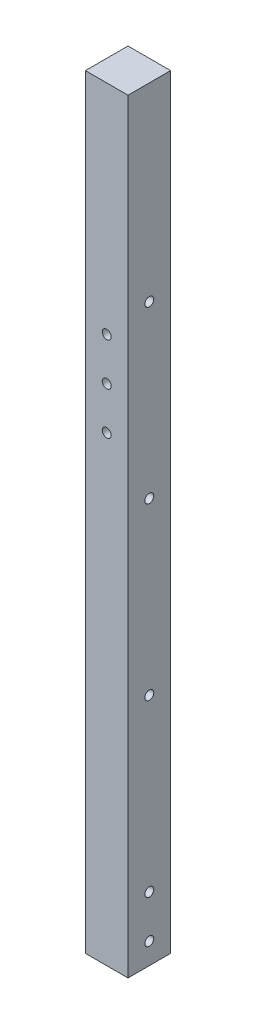
ISO-10303-21;
HEADER;
FILE_DESCRIPTION(('STEP AP214'),'2;1');
FILE_NAME('part.step','',(''),(''),'','','');
FILE_SCHEMA(('AUTOMOTIVE_DESIGN { 1 0 10303 214 1 1 1 1 }'));
ENDSEC;
DATA;
#1=APPLICATION_CONTEXT('core data for automotive mechanical design processes');
#2=APPLICATION_PROTOCOL_DEFINITION('international standard','automotive_design',2000,#1);
#3=PRODUCT_CONTEXT('',#1,'mechanical');
#4=PRODUCT('Part','Part','',(#3));
#5=PRODUCT_RELATED_PRODUCT_CATEGORY('part','',(#4));
#6=PRODUCT_DEFINITION_FORMATION('','',#4);
#7=PRODUCT_DEFINITION_CONTEXT('part definition',#1,'design');
#8=PRODUCT_DEFINITION('design','',#6,#7);
#9=PRODUCT_DEFINITION_SHAPE('','',#8);
#10=(LENGTH_UNIT() NAMED_UNIT(*) SI_UNIT(.MILLI.,.METRE.));
#11=(NAMED_UNIT(*) PLANE_ANGLE_UNIT() SI_UNIT($,.RADIAN.));
#12=(NAMED_UNIT(*) SI_UNIT($,.STERADIAN.) SOLID_ANGLE_UNIT());
#13=UNCERTAINTY_MEASURE_WITH_UNIT(LENGTH_MEASURE(1.E-05),#10,'distance_accuracy_value','');
#14=(GEOMETRIC_REPRESENTATION_CONTEXT(3) GLOBAL_UNCERTAINTY_ASSIGNED_CONTEXT((#13)) GLOBAL_UNIT_ASSIGNED_CONTEXT((#10,
#11,#12)) REPRESENTATION_CONTEXT('',''));
#15=CARTESIAN_POINT('',(0.,0.,0.));
#16=DIRECTION('',(0.,0.,1.));
#17=DIRECTION('',(1.,0.,0.));
#18=AXIS2_PLACEMENT_3D('',#15,#16,#17);
#19=CARTESIAN_POINT('',(10.,358.95,-10.));
#20=DIRECTION('',(-1.,0.,0.));
#21=DIRECTION('',(0.,0.,1.));
#22=AXIS2_PLACEMENT_3D('',#19,#20,#21);
#23=PLANE('',#22);
#24=CARTESIAN_POINT('',(10.,10.,0.));
#25=DIRECTION('',(1.,0.,0.));
#26=DIRECTION('',(0.,0.,-1.));
#27=AXIS2_PLACEMENT_3D('',#24,#25,#26);
#28=CIRCLE('',#27,2.1);
#29=CARTESIAN_POINT('',(10.,10.,-2.1));
#30=VERTEX_POINT('',#29);
#31=EDGE_CURVE('E139',#30,#30,#28,.T.);
#32=ORIENTED_EDGE('',*,*,#31,.F.);
#33=EDGE_LOOP('',(#32));
#34=FACE_BOUND('',#33,.T.);
#35=CARTESIAN_POINT('',(10.,30.,0.));
#36=DIRECTION('',(1.,0.,0.));
#37=DIRECTION('',(0.,0.,-1.));
#38=AXIS2_PLACEMENT_3D('',#35,#36,#37);
#39=CIRCLE('',#38,2.1);
#40=CARTESIAN_POINT('',(10.,30.,-2.1));
#41=VERTEX_POINT('',#40);
#42=EDGE_CURVE('E133',#41,#41,#39,.T.);
#43=ORIENTED_EDGE('',*,*,#42,.F.);
#44=EDGE_LOOP('',(#43));
#45=FACE_BOUND('',#44,.T.);
#46=CARTESIAN_POINT('',(10.,110.,2.7528728164885E-13));
#47=DIRECTION('',(1.,0.,0.));
#48=DIRECTION('',(0.,0.,-1.));
#49=AXIS2_PLACEMENT_3D('',#46,#47,#48);
#50=CIRCLE('',#49,2.1);
#51=CARTESIAN_POINT('',(10.,110.,-2.09999999999972));
#52=VERTEX_POINT('',#51);
#53=EDGE_CURVE('E127',#52,#52,#50,.T.);
#54=ORIENTED_EDGE('',*,*,#53,.F.);
#55=EDGE_LOOP('',(#54));
#56=FACE_BOUND('',#55,.T.);
#57=CARTESIAN_POINT('',(10.,190.,5.49707201559711E-13));
#58=DIRECTION('',(1.,0.,0.));
#59=DIRECTION('',(0.,0.,-1.));
#60=AXIS2_PLACEMENT_3D('',#57,#58,#59);
#61=CIRCLE('',#60,2.10000000000001);
#62=CARTESIAN_POINT('',(10.,190.,-2.09999999999946));
#63=VERTEX_POINT('',#62);
#64=EDGE_CURVE('E121',#63,#63,#61,.T.);
#65=ORIENTED_EDGE('',*,*,#64,.F.);
#66=EDGE_LOOP('',(#65));
#67=FACE_BOUND('',#66,.T.);
#68=CARTESIAN_POINT('',(10.,270.,8.24127121470572E-13));
#69=DIRECTION('',(1.,0.,0.));
#70=DIRECTION('',(0.,0.,-1.));
#71=AXIS2_PLACEMENT_3D('',#68,#69,#70);
#72=CIRCLE('',#71,2.1);
#73=CARTESIAN_POINT('',(10.,270.,-2.09999999999917));
#74=VERTEX_POINT('',#73);
#75=EDGE_CURVE('E114',#74,#74,#72,.T.);
#76=ORIENTED_EDGE('',*,*,#75,.F.);
#77=EDGE_LOOP('',(#76));
#78=FACE_BOUND('',#77,.T.);
#79=DIRECTION('',(0.,0.,-1.));
#80=VECTOR('',#79,1.);
#81=CARTESIAN_POINT('',(10.,0.,-10.));
#82=LINE('',#81,#80);
#83=CARTESIAN_POINT('',(10.,0.,10.));
#84=VERTEX_POINT('',#83);
#85=CARTESIAN_POINT('',(10.,0.,-10.));
#86=VERTEX_POINT('',#85);
#87=EDGE_CURVE('E100',#84,#86,#82,.T.);
#88=ORIENTED_EDGE('',*,*,#87,.T.);
#89=DIRECTION('',(0.,-1.,0.));
#90=VECTOR('',#89,1.);
#91=CARTESIAN_POINT('',(10.,358.95,-10.));
#92=LINE('',#91,#90);
#93=CARTESIAN_POINT('',(10.,358.95,-10.));
#94=VERTEX_POINT('',#93);
#95=EDGE_CURVE('E11',#94,#86,#92,.T.);
#96=ORIENTED_EDGE('',*,*,#95,.F.);
#97=DIRECTION('',(0.,0.,-1.));
#98=VECTOR('',#97,1.);
#99=CARTESIAN_POINT('',(10.,358.95,-10.));
#100=LINE('',#99,#98);
#101=CARTESIAN_POINT('',(10.,358.95,10.));
#102=VERTEX_POINT('',#101);
#103=EDGE_CURVE('E88',#102,#94,#100,.T.);
#104=ORIENTED_EDGE('',*,*,#103,.F.);
#105=DIRECTION('',(0.,-1.,0.));
#106=VECTOR('',#105,1.);
#107=CARTESIAN_POINT('',(10.,358.95,10.));
#108=LINE('',#107,#106);
#109=EDGE_CURVE('E96',#102,#84,#108,.T.);
#110=ORIENTED_EDGE('',*,*,#109,.T.);
#111=EDGE_LOOP('',(#88,#96,#104,#110));
#112=FACE_BOUND('',#111,.T.);
#113=ADVANCED_FACE('F37',(#34,#45,#56,#67,#78,#112),#23,.F.);
#114=CARTESIAN_POINT('',(-10.,358.95,-10.));
#115=DIRECTION('',(0.,0.,1.));
#116=DIRECTION('',(1.,0.,0.));
#117=AXIS2_PLACEMENT_3D('',#114,#115,#116);
#118=PLANE('',#117);
#119=CARTESIAN_POINT('',(0.,216.69,-10.));
#120=DIRECTION('',(0.,0.,-1.));
#121=DIRECTION('',(-1.,0.,0.));
#122=AXIS2_PLACEMENT_3D('',#119,#120,#121);
#123=CIRCLE('',#122,2.1);
#124=CARTESIAN_POINT('',(-2.1,216.69,-10.));
#125=VERTEX_POINT('',#124);
#126=EDGE_CURVE('E156',#125,#125,#123,.T.);
#127=ORIENTED_EDGE('',*,*,#126,.F.);
#128=EDGE_LOOP('',(#127));
#129=FACE_BOUND('',#128,.T.);
#130=CARTESIAN_POINT('',(0.,236.69,-10.));
#131=DIRECTION('',(0.,0.,-1.));
#132=DIRECTION('',(-1.,0.,0.));
#133=AXIS2_PLACEMENT_3D('',#130,#131,#132);
#134=CIRCLE('',#133,2.1);
#135=CARTESIAN_POINT('',(-2.09999999999993,236.69,-10.));
#136=VERTEX_POINT('',#135);
#137=EDGE_CURVE('E150',#136,#136,#134,.T.);
#138=ORIENTED_EDGE('',*,*,#137,.F.);
#139=EDGE_LOOP('',(#138));
#140=FACE_BOUND('',#139,.T.);
#141=CARTESIAN_POINT('',(1.37209959955431E-13,256.69,-10.));
#142=DIRECTION('',(0.,0.,-1.));
#143=DIRECTION('',(-1.,0.,0.));
#144=AXIS2_PLACEMENT_3D('',#141,#142,#143);
#145=CIRCLE('',#144,2.1);
#146=CARTESIAN_POINT('',(-2.09999999999986,256.69,-10.));
#147=VERTEX_POINT('',#146);
#148=EDGE_CURVE('E144',#147,#147,#145,.T.);
#149=ORIENTED_EDGE('',*,*,#148,.F.);
#150=EDGE_LOOP('',(#149));
#151=FACE_BOUND('',#150,.T.);
#152=DIRECTION('',(-1.,0.,0.));
#153=VECTOR('',#152,1.);
#154=CARTESIAN_POINT('',(-10.,0.,-10.));
#155=LINE('',#154,#153);
#156=CARTESIAN_POINT('',(-10.,0.,-10.));
#157=VERTEX_POINT('',#156);
#158=EDGE_CURVE('E92',#86,#157,#155,.T.);
#159=ORIENTED_EDGE('',*,*,#158,.T.);
#160=DIRECTION('',(0.,-1.,0.));
#161=VECTOR('',#160,1.);
#162=CARTESIAN_POINT('',(-10.,358.95,-10.));
#163=LINE('',#162,#161);
#164=CARTESIAN_POINT('',(-10.,358.95,-10.));
#165=VERTEX_POINT('',#164);
#166=EDGE_CURVE('E45',#165,#157,#163,.T.);
#167=ORIENTED_EDGE('',*,*,#166,.F.);
#168=DIRECTION('',(-1.,0.,0.));
#169=VECTOR('',#168,1.);
#170=CARTESIAN_POINT('',(-10.,358.95,-10.));
#171=LINE('',#170,#169);
#172=EDGE_CURVE('E83',#94,#165,#171,.T.);
#173=ORIENTED_EDGE('',*,*,#172,.F.);
#174=ORIENTED_EDGE('',*,*,#95,.T.);
#175=EDGE_LOOP('',(#159,#167,#173,#174));
#176=FACE_BOUND('',#175,.T.);
#177=ADVANCED_FACE('F91',(#129,#140,#151,#176),#118,.F.);
#178=CARTESIAN_POINT('',(-10.,358.95,-10.));
#179=DIRECTION('',(1.,0.,0.));
#180=DIRECTION('',(0.,0.,-1.));
#181=AXIS2_PLACEMENT_3D('',#178,#179,#180);
#182=PLANE('',#181);
#183=CARTESIAN_POINT('',(-10.,10.,0.));
#184=DIRECTION('',(1.,0.,0.));
#185=DIRECTION('',(0.,0.,-1.));
#186=AXIS2_PLACEMENT_3D('',#183,#184,#185);
#187=CIRCLE('',#186,2.1);
#188=CARTESIAN_POINT('',(-10.,10.,-2.1));
#189=VERTEX_POINT('',#188);
#190=EDGE_CURVE('E103',#189,#189,#187,.T.);
#191=ORIENTED_EDGE('',*,*,#190,.T.);
#192=EDGE_LOOP('',(#191));
#193=FACE_BOUND('',#192,.T.);
#194=CARTESIAN_POINT('',(-10.,30.,0.));
#195=DIRECTION('',(1.,0.,0.));
#196=DIRECTION('',(0.,0.,-1.));
#197=AXIS2_PLACEMENT_3D('',#194,#195,#196);
#198=CIRCLE('',#197,2.1);
#199=CARTESIAN_POINT('',(-10.,30.,-2.1));
#200=VERTEX_POINT('',#199);
#201=EDGE_CURVE('E136',#200,#200,#198,.T.);
#202=ORIENTED_EDGE('',*,*,#201,.T.);
#203=EDGE_LOOP('',(#202));
#204=FACE_BOUND('',#203,.T.);
#205=CARTESIAN_POINT('',(-10.,110.,2.77022005124827E-13));
#206=DIRECTION('',(1.,0.,0.));
#207=DIRECTION('',(0.,0.,-1.));
#208=AXIS2_PLACEMENT_3D('',#205,#206,#207);
#209=CIRCLE('',#208,2.1);
#210=CARTESIAN_POINT('',(-10.,110.,-2.09999999999972));
#211=VERTEX_POINT('',#210);
#212=EDGE_CURVE('E130',#211,#211,#209,.T.);
#213=ORIENTED_EDGE('',*,*,#212,.T.);
#214=EDGE_LOOP('',(#213));
#215=FACE_BOUND('',#214,.T.);
#216=CARTESIAN_POINT('',(-10.,190.,5.51441925035688E-13));
#217=DIRECTION('',(1.,0.,0.));
#218=DIRECTION('',(0.,0.,-1.));
#219=AXIS2_PLACEMENT_3D('',#216,#217,#218);
#220=CIRCLE('',#219,2.10000000000001);
#221=CARTESIAN_POINT('',(-10.,190.,-2.09999999999946));
#222=VERTEX_POINT('',#221);
#223=EDGE_CURVE('E124',#222,#222,#220,.T.);
#224=ORIENTED_EDGE('',*,*,#223,.T.);
#225=EDGE_LOOP('',(#224));
#226=FACE_BOUND('',#225,.T.);
#227=CARTESIAN_POINT('',(-10.,270.,8.25861844946549E-13));
#228=DIRECTION('',(1.,0.,0.));
#229=DIRECTION('',(0.,0.,-1.));
#230=AXIS2_PLACEMENT_3D('',#227,#228,#229);
#231=CIRCLE('',#230,2.1);
#232=CARTESIAN_POINT('',(-10.,270.,-2.09999999999917));
#233=VERTEX_POINT('',#232);
#234=EDGE_CURVE('E117',#233,#233,#231,.T.);
#235=ORIENTED_EDGE('',*,*,#234,.T.);
#236=EDGE_LOOP('',(#235));
#237=FACE_BOUND('',#236,.T.);
#238=DIRECTION('',(0.,0.,1.));
#239=VECTOR('',#238,1.);
#240=CARTESIAN_POINT('',(-10.,0.,-10.));
#241=LINE('',#240,#239);
#242=CARTESIAN_POINT('',(-10.,0.,10.));
#243=VERTEX_POINT('',#242);
#244=EDGE_CURVE('E70',#157,#243,#241,.T.);
#245=ORIENTED_EDGE('',*,*,#244,.T.);
#246=DIRECTION('',(0.,-1.,0.));
#247=VECTOR('',#246,1.);
#248=CARTESIAN_POINT('',(-10.,358.95,10.));
#249=LINE('',#248,#247);
#250=CARTESIAN_POINT('',(-10.,358.95,10.));
#251=VERTEX_POINT('',#250);
#252=EDGE_CURVE('E93',#251,#243,#249,.T.);
#253=ORIENTED_EDGE('',*,*,#252,.F.);
#254=DIRECTION('',(0.,0.,1.));
#255=VECTOR('',#254,1.);
#256=CARTESIAN_POINT('',(-10.,358.95,-10.));
#257=LINE('',#256,#255);
#258=EDGE_CURVE('E86',#165,#251,#257,.T.);
#259=ORIENTED_EDGE('',*,*,#258,.F.);
#260=ORIENTED_EDGE('',*,*,#166,.T.);
#261=EDGE_LOOP('',(#245,#253,#259,#260));
#262=FACE_BOUND('',#261,.T.);
#263=ADVANCED_FACE('F94',(#193,#204,#215,#226,#237,#262),#182,.F.);
#264=CARTESIAN_POINT('',(-10.,358.95,10.));
#265=DIRECTION('',(0.,0.,-1.));
#266=DIRECTION('',(-1.,0.,0.));
#267=AXIS2_PLACEMENT_3D('',#264,#265,#266);
#268=PLANE('',#267);
#269=CARTESIAN_POINT('',(0.,216.69,10.));
#270=DIRECTION('',(0.,0.,-1.));
#271=DIRECTION('',(-1.,0.,0.));
#272=AXIS2_PLACEMENT_3D('',#269,#270,#271);
#273=CIRCLE('',#272,2.1);
#274=CARTESIAN_POINT('',(-2.1,216.69,10.));
#275=VERTEX_POINT('',#274);
#276=EDGE_CURVE('E118',#275,#275,#273,.T.);
#277=ORIENTED_EDGE('',*,*,#276,.T.);
#278=EDGE_LOOP('',(#277));
#279=FACE_BOUND('',#278,.T.);
#280=CARTESIAN_POINT('',(0.,236.69,10.));
#281=DIRECTION('',(0.,0.,-1.));
#282=DIRECTION('',(-1.,0.,0.));
#283=AXIS2_PLACEMENT_3D('',#280,#281,#282);
#284=CIRCLE('',#283,2.1);
#285=CARTESIAN_POINT('',(-2.09999999999993,236.69,10.));
#286=VERTEX_POINT('',#285);
#287=EDGE_CURVE('E153',#286,#286,#284,.T.);
#288=ORIENTED_EDGE('',*,*,#287,.T.);
#289=EDGE_LOOP('',(#288));
#290=FACE_BOUND('',#289,.T.);
#291=CARTESIAN_POINT('',(1.37209959955431E-13,256.69,10.));
#292=DIRECTION('',(0.,0.,-1.));
#293=DIRECTION('',(-1.,0.,0.));
#294=AXIS2_PLACEMENT_3D('',#291,#292,#293);
#295=CIRCLE('',#294,2.1);
#296=CARTESIAN_POINT('',(-2.09999999999986,256.69,10.));
#297=VERTEX_POINT('',#296);
#298=EDGE_CURVE('E147',#297,#297,#295,.T.);
#299=ORIENTED_EDGE('',*,*,#298,.T.);
#300=EDGE_LOOP('',(#299));
#301=FACE_BOUND('',#300,.T.);
#302=DIRECTION('',(1.,0.,0.));
#303=VECTOR('',#302,1.);
#304=CARTESIAN_POINT('',(-10.,0.,10.));
#305=LINE('',#304,#303);
#306=EDGE_CURVE('E76',#243,#84,#305,.T.);
#307=ORIENTED_EDGE('',*,*,#306,.T.);
#308=ORIENTED_EDGE('',*,*,#109,.F.);
#309=DIRECTION('',(1.,0.,0.));
#310=VECTOR('',#309,1.);
#311=CARTESIAN_POINT('',(-10.,358.95,10.));
#312=LINE('',#311,#310);
#313=EDGE_CURVE('E53',#251,#102,#312,.T.);
#314=ORIENTED_EDGE('',*,*,#313,.F.);
#315=ORIENTED_EDGE('',*,*,#252,.T.);
#316=EDGE_LOOP('',(#307,#308,#314,#315));
#317=FACE_BOUND('',#316,.T.);
#318=ADVANCED_FACE('F108',(#279,#290,#301,#317),#268,.F.);
#319=CARTESIAN_POINT('',(0.,358.95,0.));
#320=DIRECTION('',(0.,1.,0.));
#321=DIRECTION('',(0.,0.,1.));
#322=AXIS2_PLACEMENT_3D('',#319,#320,#321);
#323=PLANE('',#322);
#324=ORIENTED_EDGE('',*,*,#103,.T.);
#325=ORIENTED_EDGE('',*,*,#172,.T.);
#326=ORIENTED_EDGE('',*,*,#258,.T.);
#327=ORIENTED_EDGE('',*,*,#313,.T.);
#328=EDGE_LOOP('',(#324,#325,#326,#327));
#329=FACE_BOUND('',#328,.T.);
#330=ADVANCED_FACE('F84',(#329),#323,.T.);
#331=CARTESIAN_POINT('',(0.,0.,0.));
#332=DIRECTION('',(0.,1.,0.));
#333=DIRECTION('',(0.,0.,1.));
#334=AXIS2_PLACEMENT_3D('',#331,#332,#333);
#335=PLANE('',#334);
#336=ORIENTED_EDGE('',*,*,#87,.F.);
#337=ORIENTED_EDGE('',*,*,#306,.F.);
#338=ORIENTED_EDGE('',*,*,#244,.F.);
#339=ORIENTED_EDGE('',*,*,#158,.F.);
#340=EDGE_LOOP('',(#336,#337,#338,#339));
#341=FACE_BOUND('',#340,.T.);
#342=ADVANCED_FACE('F111',(#341),#335,.F.);
#343=CARTESIAN_POINT('',(-10.,270.,8.25861844946549E-13));
#344=DIRECTION('',(1.,0.,0.));
#345=DIRECTION('',(0.,0.,-1.));
#346=AXIS2_PLACEMENT_3D('',#343,#344,#345);
#347=CYLINDRICAL_SURFACE('',#346,2.1);
#348=ORIENTED_EDGE('',*,*,#234,.F.);
#349=EDGE_LOOP('',(#348));
#350=FACE_BOUND('',#349,.T.);
#351=ORIENTED_EDGE('',*,*,#75,.T.);
#352=EDGE_LOOP('',(#351));
#353=FACE_BOUND('',#352,.T.);
#354=ADVANCED_FACE('F206',(#350,#353),#347,.F.);
#355=CARTESIAN_POINT('',(-10.,190.,5.51441925035688E-13));
#356=DIRECTION('',(1.,0.,0.));
#357=DIRECTION('',(0.,0.,-1.));
#358=AXIS2_PLACEMENT_3D('',#355,#356,#357);
#359=CYLINDRICAL_SURFACE('',#358,2.10000000000001);
#360=ORIENTED_EDGE('',*,*,#223,.F.);
#361=EDGE_LOOP('',(#360));
#362=FACE_BOUND('',#361,.T.);
#363=ORIENTED_EDGE('',*,*,#64,.T.);
#364=EDGE_LOOP('',(#363));
#365=FACE_BOUND('',#364,.T.);
#366=ADVANCED_FACE('F208',(#362,#365),#359,.F.);
#367=CARTESIAN_POINT('',(-10.,110.,2.77022005124827E-13));
#368=DIRECTION('',(1.,0.,0.));
#369=DIRECTION('',(0.,0.,-1.));
#370=AXIS2_PLACEMENT_3D('',#367,#368,#369);
#371=CYLINDRICAL_SURFACE('',#370,2.1);
#372=ORIENTED_EDGE('',*,*,#212,.F.);
#373=EDGE_LOOP('',(#372));
#374=FACE_BOUND('',#373,.T.);
#375=ORIENTED_EDGE('',*,*,#53,.T.);
#376=EDGE_LOOP('',(#375));
#377=FACE_BOUND('',#376,.T.);
#378=ADVANCED_FACE('F215',(#374,#377),#371,.F.);
#379=CARTESIAN_POINT('',(-10.,30.,0.));
#380=DIRECTION('',(1.,0.,0.));
#381=DIRECTION('',(0.,0.,-1.));
#382=AXIS2_PLACEMENT_3D('',#379,#380,#381);
#383=CYLINDRICAL_SURFACE('',#382,2.1);
#384=ORIENTED_EDGE('',*,*,#201,.F.);
#385=EDGE_LOOP('',(#384));
#386=FACE_BOUND('',#385,.T.);
#387=ORIENTED_EDGE('',*,*,#42,.T.);
#388=EDGE_LOOP('',(#387));
#389=FACE_BOUND('',#388,.T.);
#390=ADVANCED_FACE('F188',(#386,#389),#383,.F.);
#391=CARTESIAN_POINT('',(-10.,10.,0.));
#392=DIRECTION('',(1.,0.,0.));
#393=DIRECTION('',(0.,0.,-1.));
#394=AXIS2_PLACEMENT_3D('',#391,#392,#393);
#395=CYLINDRICAL_SURFACE('',#394,2.1);
#396=ORIENTED_EDGE('',*,*,#190,.F.);
#397=EDGE_LOOP('',(#396));
#398=FACE_BOUND('',#397,.T.);
#399=ORIENTED_EDGE('',*,*,#31,.T.);
#400=EDGE_LOOP('',(#399));
#401=FACE_BOUND('',#400,.T.);
#402=ADVANCED_FACE('F179',(#398,#401),#395,.F.);
#403=CARTESIAN_POINT('',(1.37209959955431E-13,256.69,10.));
#404=DIRECTION('',(0.,0.,-1.));
#405=DIRECTION('',(-1.,0.,0.));
#406=AXIS2_PLACEMENT_3D('',#403,#404,#405);
#407=CYLINDRICAL_SURFACE('',#406,2.1);
#408=ORIENTED_EDGE('',*,*,#298,.F.);
#409=EDGE_LOOP('',(#408));
#410=FACE_BOUND('',#409,.T.);
#411=ORIENTED_EDGE('',*,*,#148,.T.);
#412=EDGE_LOOP('',(#411));
#413=FACE_BOUND('',#412,.T.);
#414=ADVANCED_FACE('F177',(#410,#413),#407,.F.);
#415=CARTESIAN_POINT('',(0.,236.69,10.));
#416=DIRECTION('',(0.,0.,-1.));
#417=DIRECTION('',(-1.,0.,0.));
#418=AXIS2_PLACEMENT_3D('',#415,#416,#417);
#419=CYLINDRICAL_SURFACE('',#418,2.1);
#420=ORIENTED_EDGE('',*,*,#287,.F.);
#421=EDGE_LOOP('',(#420));
#422=FACE_BOUND('',#421,.T.);
#423=ORIENTED_EDGE('',*,*,#137,.T.);
#424=EDGE_LOOP('',(#423));
#425=FACE_BOUND('',#424,.T.);
#426=ADVANCED_FACE('F167',(#422,#425),#419,.F.);
#427=CARTESIAN_POINT('',(0.,216.69,10.));
#428=DIRECTION('',(0.,0.,-1.));
#429=DIRECTION('',(-1.,0.,0.));
#430=AXIS2_PLACEMENT_3D('',#427,#428,#429);
#431=CYLINDRICAL_SURFACE('',#430,2.1);
#432=ORIENTED_EDGE('',*,*,#276,.F.);
#433=EDGE_LOOP('',(#432));
#434=FACE_BOUND('',#433,.T.);
#435=ORIENTED_EDGE('',*,*,#126,.T.);
#436=EDGE_LOOP('',(#435));
#437=FACE_BOUND('',#436,.T.);
#438=ADVANCED_FACE('F164',(#434,#437),#431,.F.);
#439=CLOSED_SHELL('',(#113,#177,#263,#318,#330,#342,#354,#366,#378,#390,#402,#414,#426,#438));
#440=MANIFOLD_SOLID_BREP('B2',#439);
#441=ADVANCED_BREP_SHAPE_REPRESENTATION('',(#18,#440),#14);
#442=SHAPE_DEFINITION_REPRESENTATION(#9,#441);
ENDSEC;
END-ISO-10303-21;
